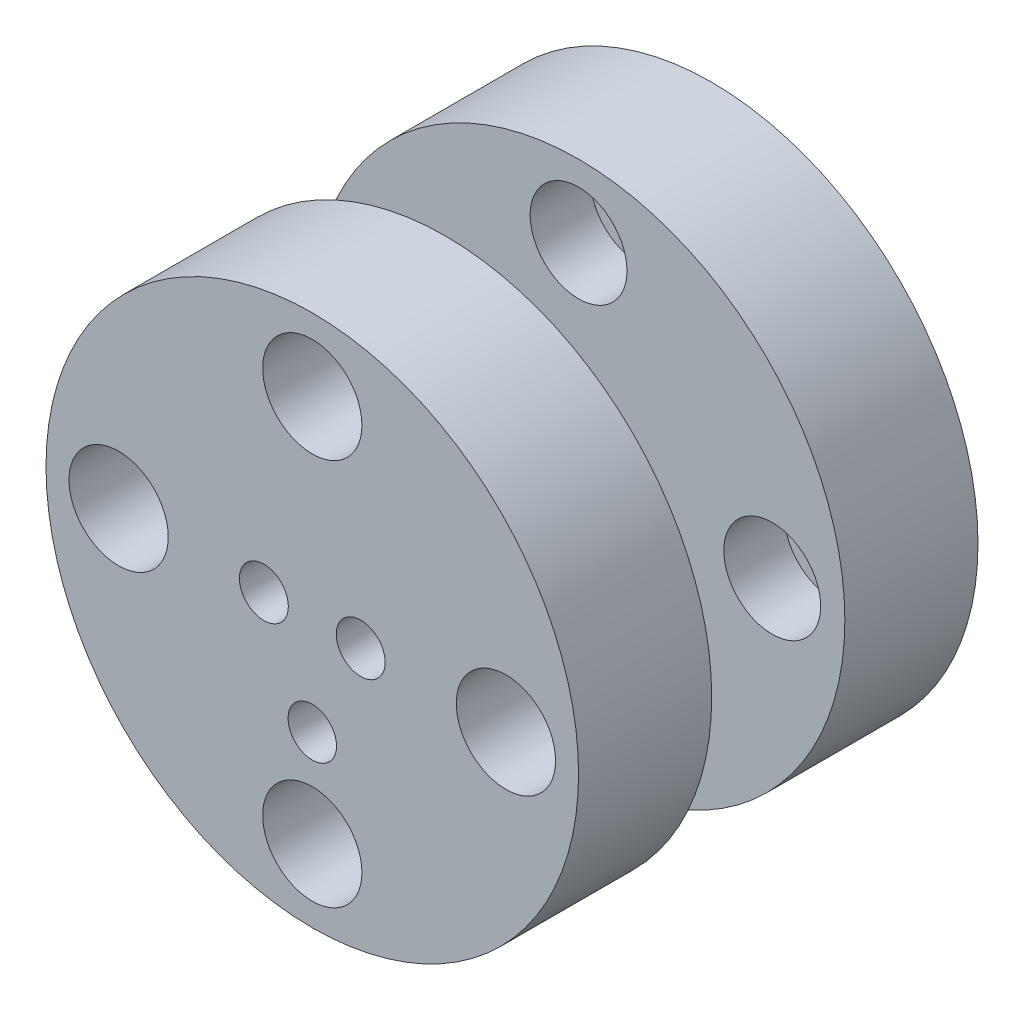
ISO-10303-21;
HEADER;
FILE_DESCRIPTION(('STEP AP214'),'2;1');
FILE_NAME('part.step','',(''),(''),'','','');
FILE_SCHEMA(('AUTOMOTIVE_DESIGN { 1 0 10303 214 1 1 1 1 }'));
ENDSEC;
DATA;
#1=APPLICATION_CONTEXT('core data for automotive mechanical design processes');
#2=APPLICATION_PROTOCOL_DEFINITION('international standard','automotive_design',2000,#1);
#3=PRODUCT_CONTEXT('',#1,'mechanical');
#4=PRODUCT('Part','Part','',(#3));
#5=PRODUCT_RELATED_PRODUCT_CATEGORY('part','',(#4));
#6=PRODUCT_DEFINITION_FORMATION('','',#4);
#7=PRODUCT_DEFINITION_CONTEXT('part definition',#1,'design');
#8=PRODUCT_DEFINITION('design','',#6,#7);
#9=PRODUCT_DEFINITION_SHAPE('','',#8);
#10=(LENGTH_UNIT() NAMED_UNIT(*) SI_UNIT(.MILLI.,.METRE.));
#11=(NAMED_UNIT(*) PLANE_ANGLE_UNIT() SI_UNIT($,.RADIAN.));
#12=(NAMED_UNIT(*) SI_UNIT($,.STERADIAN.) SOLID_ANGLE_UNIT());
#13=UNCERTAINTY_MEASURE_WITH_UNIT(LENGTH_MEASURE(1.E-05),#10,'distance_accuracy_value','');
#14=(GEOMETRIC_REPRESENTATION_CONTEXT(3) GLOBAL_UNCERTAINTY_ASSIGNED_CONTEXT((#13)) GLOBAL_UNIT_ASSIGNED_CONTEXT((#10,
#11,#12)) REPRESENTATION_CONTEXT('',''));
#15=CARTESIAN_POINT('',(0.,0.,0.));
#16=DIRECTION('',(0.,0.,1.));
#17=DIRECTION('',(1.,0.,0.));
#18=AXIS2_PLACEMENT_3D('',#15,#16,#17);
#19=CARTESIAN_POINT('',(0.,0.,16.5));
#20=DIRECTION('',(0.,0.,1.));
#21=DIRECTION('',(1.,0.,0.));
#22=AXIS2_PLACEMENT_3D('',#19,#20,#21);
#23=PLANE('',#22);
#24=CARTESIAN_POINT('',(0.,-4.,16.5));
#25=DIRECTION('',(0.,0.,1.));
#26=DIRECTION('',(1.,0.,0.));
#27=AXIS2_PLACEMENT_3D('',#24,#25,#26);
#28=CIRCLE('',#27,1.);
#29=CARTESIAN_POINT('',(1.,-4.,16.5));
#30=VERTEX_POINT('',#29);
#31=EDGE_CURVE('E127',#30,#30,#28,.T.);
#32=ORIENTED_EDGE('',*,*,#31,.F.);
#33=EDGE_LOOP('',(#32));
#34=FACE_BOUND('',#33,.T.);
#35=CARTESIAN_POINT('',(-2.,0.,16.5));
#36=DIRECTION('',(0.,0.,1.));
#37=DIRECTION('',(1.,0.,0.));
#38=AXIS2_PLACEMENT_3D('',#35,#36,#37);
#39=CIRCLE('',#38,1.01);
#40=CARTESIAN_POINT('',(-0.99,0.,16.5));
#41=VERTEX_POINT('',#40);
#42=EDGE_CURVE('E64',#41,#41,#39,.T.);
#43=ORIENTED_EDGE('',*,*,#42,.F.);
#44=EDGE_LOOP('',(#43));
#45=FACE_BOUND('',#44,.T.);
#46=CARTESIAN_POINT('',(2.,0.,16.5));
#47=DIRECTION('',(0.,0.,1.));
#48=DIRECTION('',(-1.,0.,0.));
#49=AXIS2_PLACEMENT_3D('',#46,#47,#48);
#50=CIRCLE('',#49,1.01);
#51=CARTESIAN_POINT('',(3.01,0.,16.5));
#52=VERTEX_POINT('',#51);
#53=EDGE_CURVE('E70',#52,#52,#50,.T.);
#54=ORIENTED_EDGE('',*,*,#53,.F.);
#55=EDGE_LOOP('',(#54));
#56=FACE_BOUND('',#55,.T.);
#57=CARTESIAN_POINT('',(8.,0.,16.5));
#58=DIRECTION('',(0.,0.,1.));
#59=DIRECTION('',(1.,0.,0.));
#60=AXIS2_PLACEMENT_3D('',#57,#58,#59);
#61=CIRCLE('',#60,2.05);
#62=CARTESIAN_POINT('',(10.05,0.,16.5));
#63=VERTEX_POINT('',#62);
#64=EDGE_CURVE('E86',#63,#63,#61,.T.);
#65=ORIENTED_EDGE('',*,*,#64,.F.);
#66=EDGE_LOOP('',(#65));
#67=FACE_BOUND('',#66,.T.);
#68=CARTESIAN_POINT('',(-8.,0.,16.5));
#69=DIRECTION('',(0.,0.,1.));
#70=DIRECTION('',(1.,0.,0.));
#71=AXIS2_PLACEMENT_3D('',#68,#69,#70);
#72=CIRCLE('',#71,2.05);
#73=CARTESIAN_POINT('',(-5.95,0.,16.5));
#74=VERTEX_POINT('',#73);
#75=EDGE_CURVE('E57',#74,#74,#72,.T.);
#76=ORIENTED_EDGE('',*,*,#75,.F.);
#77=EDGE_LOOP('',(#76));
#78=FACE_BOUND('',#77,.T.);
#79=CARTESIAN_POINT('',(0.,0.,16.5));
#80=DIRECTION('',(0.,0.,1.));
#81=DIRECTION('',(1.,0.,0.));
#82=AXIS2_PLACEMENT_3D('',#79,#80,#81);
#83=CIRCLE('',#82,11.);
#84=CARTESIAN_POINT('',(11.,0.,16.5));
#85=VERTEX_POINT('',#84);
#86=EDGE_CURVE('E11',#85,#85,#83,.T.);
#87=ORIENTED_EDGE('',*,*,#86,.T.);
#88=EDGE_LOOP('',(#87));
#89=FACE_BOUND('',#88,.T.);
#90=CARTESIAN_POINT('',(0.,8.,16.5));
#91=DIRECTION('',(0.,0.,1.));
#92=DIRECTION('',(1.,0.,0.));
#93=AXIS2_PLACEMENT_3D('',#90,#91,#92);
#94=CIRCLE('',#93,2.05);
#95=CARTESIAN_POINT('',(2.05,8.,16.5));
#96=VERTEX_POINT('',#95);
#97=EDGE_CURVE('E92',#96,#96,#94,.T.);
#98=ORIENTED_EDGE('',*,*,#97,.F.);
#99=EDGE_LOOP('',(#98));
#100=FACE_BOUND('',#99,.T.);
#101=CARTESIAN_POINT('',(0.,-8.,16.5));
#102=DIRECTION('',(0.,0.,1.));
#103=DIRECTION('',(1.,0.,0.));
#104=AXIS2_PLACEMENT_3D('',#101,#102,#103);
#105=CIRCLE('',#104,2.05);
#106=CARTESIAN_POINT('',(2.05,-8.,16.5));
#107=VERTEX_POINT('',#106);
#108=EDGE_CURVE('E80',#107,#107,#105,.T.);
#109=ORIENTED_EDGE('',*,*,#108,.F.);
#110=EDGE_LOOP('',(#109));
#111=FACE_BOUND('',#110,.T.);
#112=ADVANCED_FACE('F44',(#34,#45,#56,#67,#78,#89,#100,#111),#23,.T.);
#113=CARTESIAN_POINT('',(0.,0.,11.));
#114=DIRECTION('',(0.,0.,1.));
#115=DIRECTION('',(1.,0.,0.));
#116=AXIS2_PLACEMENT_3D('',#113,#114,#115);
#117=PLANE('',#116);
#118=CARTESIAN_POINT('',(0.,-4.,11.));
#119=DIRECTION('',(0.,0.,1.));
#120=DIRECTION('',(1.,0.,0.));
#121=AXIS2_PLACEMENT_3D('',#118,#119,#120);
#122=CIRCLE('',#121,1.);
#123=CARTESIAN_POINT('',(1.,-4.,11.));
#124=VERTEX_POINT('',#123);
#125=EDGE_CURVE('E75',#124,#124,#122,.F.);
#126=ORIENTED_EDGE('',*,*,#125,.F.);
#127=EDGE_LOOP('',(#126));
#128=FACE_BOUND('',#127,.T.);
#129=CARTESIAN_POINT('',(-2.,0.,11.));
#130=DIRECTION('',(0.,0.,1.));
#131=DIRECTION('',(1.,0.,0.));
#132=AXIS2_PLACEMENT_3D('',#129,#130,#131);
#133=CIRCLE('',#132,1.01);
#134=CARTESIAN_POINT('',(-0.99,0.,11.));
#135=VERTEX_POINT('',#134);
#136=EDGE_CURVE('E48',#135,#135,#133,.T.);
#137=ORIENTED_EDGE('',*,*,#136,.T.);
#138=EDGE_LOOP('',(#137));
#139=FACE_BOUND('',#138,.T.);
#140=CARTESIAN_POINT('',(2.,0.,11.));
#141=DIRECTION('',(0.,0.,1.));
#142=DIRECTION('',(1.,0.,0.));
#143=AXIS2_PLACEMENT_3D('',#140,#141,#142);
#144=CIRCLE('',#143,1.01);
#145=CARTESIAN_POINT('',(3.01,0.,11.));
#146=VERTEX_POINT('',#145);
#147=EDGE_CURVE('E62',#146,#146,#144,.T.);
#148=ORIENTED_EDGE('',*,*,#147,.T.);
#149=EDGE_LOOP('',(#148));
#150=FACE_BOUND('',#149,.T.);
#151=CARTESIAN_POINT('',(0.,0.,11.));
#152=DIRECTION('',(0.,0.,1.));
#153=DIRECTION('',(1.,0.,0.));
#154=AXIS2_PLACEMENT_3D('',#151,#152,#153);
#155=CIRCLE('',#154,11.);
#156=CARTESIAN_POINT('',(11.,0.,11.));
#157=VERTEX_POINT('',#156);
#158=EDGE_CURVE('E52',#157,#157,#155,.T.);
#159=ORIENTED_EDGE('',*,*,#158,.F.);
#160=EDGE_LOOP('',(#159));
#161=FACE_BOUND('',#160,.T.);
#162=CARTESIAN_POINT('',(-8.,0.,11.));
#163=DIRECTION('',(0.,0.,1.));
#164=DIRECTION('',(1.,0.,0.));
#165=AXIS2_PLACEMENT_3D('',#162,#163,#164);
#166=CIRCLE('',#165,2.05);
#167=CARTESIAN_POINT('',(-5.95,0.,11.));
#168=VERTEX_POINT('',#167);
#169=EDGE_CURVE('E60',#168,#168,#166,.T.);
#170=ORIENTED_EDGE('',*,*,#169,.T.);
#171=EDGE_LOOP('',(#170));
#172=FACE_BOUND('',#171,.T.);
#173=CARTESIAN_POINT('',(0.,8.,11.));
#174=DIRECTION('',(0.,0.,1.));
#175=DIRECTION('',(1.,0.,0.));
#176=AXIS2_PLACEMENT_3D('',#173,#174,#175);
#177=CIRCLE('',#176,2.05);
#178=CARTESIAN_POINT('',(2.05,8.,11.));
#179=VERTEX_POINT('',#178);
#180=EDGE_CURVE('E89',#179,#179,#177,.T.);
#181=ORIENTED_EDGE('',*,*,#180,.T.);
#182=EDGE_LOOP('',(#181));
#183=FACE_BOUND('',#182,.T.);
#184=CARTESIAN_POINT('',(8.,0.,11.));
#185=DIRECTION('',(0.,0.,1.));
#186=DIRECTION('',(1.,0.,0.));
#187=AXIS2_PLACEMENT_3D('',#184,#185,#186);
#188=CIRCLE('',#187,2.05);
#189=CARTESIAN_POINT('',(10.05,0.,11.));
#190=VERTEX_POINT('',#189);
#191=EDGE_CURVE('E83',#190,#190,#188,.T.);
#192=ORIENTED_EDGE('',*,*,#191,.T.);
#193=EDGE_LOOP('',(#192));
#194=FACE_BOUND('',#193,.T.);
#195=CARTESIAN_POINT('',(0.,-8.,11.));
#196=DIRECTION('',(0.,0.,1.));
#197=DIRECTION('',(1.,0.,0.));
#198=AXIS2_PLACEMENT_3D('',#195,#196,#197);
#199=CIRCLE('',#198,2.05);
#200=CARTESIAN_POINT('',(2.05,-8.,11.));
#201=VERTEX_POINT('',#200);
#202=EDGE_CURVE('E68',#201,#201,#199,.T.);
#203=ORIENTED_EDGE('',*,*,#202,.T.);
#204=EDGE_LOOP('',(#203));
#205=FACE_BOUND('',#204,.T.);
#206=ADVANCED_FACE('F102',(#128,#139,#150,#161,#172,#183,#194,#205),#117,.F.);
#207=CARTESIAN_POINT('',(0.,0.,16.5));
#208=DIRECTION('',(0.,0.,-1.));
#209=DIRECTION('',(-1.,0.,0.));
#210=AXIS2_PLACEMENT_3D('',#207,#208,#209);
#211=CYLINDRICAL_SURFACE('',#210,11.);
#212=ORIENTED_EDGE('',*,*,#86,.F.);
#213=EDGE_LOOP('',(#212));
#214=FACE_BOUND('',#213,.T.);
#215=ORIENTED_EDGE('',*,*,#158,.T.);
#216=EDGE_LOOP('',(#215));
#217=FACE_BOUND('',#216,.T.);
#218=ADVANCED_FACE('F46',(#214,#217),#211,.T.);
#219=CARTESIAN_POINT('',(-8.,0.,16.5));
#220=DIRECTION('',(0.,0.,-1.));
#221=DIRECTION('',(-1.,0.,0.));
#222=AXIS2_PLACEMENT_3D('',#219,#220,#221);
#223=CYLINDRICAL_SURFACE('',#222,2.05);
#224=ORIENTED_EDGE('',*,*,#75,.T.);
#225=EDGE_LOOP('',(#224));
#226=FACE_BOUND('',#225,.T.);
#227=ORIENTED_EDGE('',*,*,#169,.F.);
#228=EDGE_LOOP('',(#227));
#229=FACE_BOUND('',#228,.T.);
#230=ADVANCED_FACE('F105',(#226,#229),#223,.F.);
#231=CARTESIAN_POINT('',(0.,8.,16.5));
#232=DIRECTION('',(0.,0.,-1.));
#233=DIRECTION('',(-1.,0.,0.));
#234=AXIS2_PLACEMENT_3D('',#231,#232,#233);
#235=CYLINDRICAL_SURFACE('',#234,2.05);
#236=ORIENTED_EDGE('',*,*,#97,.T.);
#237=EDGE_LOOP('',(#236));
#238=FACE_BOUND('',#237,.T.);
#239=ORIENTED_EDGE('',*,*,#180,.F.);
#240=EDGE_LOOP('',(#239));
#241=FACE_BOUND('',#240,.T.);
#242=ADVANCED_FACE('F107',(#238,#241),#235,.F.);
#243=CARTESIAN_POINT('',(8.,0.,16.5));
#244=DIRECTION('',(0.,0.,-1.));
#245=DIRECTION('',(-1.,0.,0.));
#246=AXIS2_PLACEMENT_3D('',#243,#244,#245);
#247=CYLINDRICAL_SURFACE('',#246,2.05);
#248=ORIENTED_EDGE('',*,*,#64,.T.);
#249=EDGE_LOOP('',(#248));
#250=FACE_BOUND('',#249,.T.);
#251=ORIENTED_EDGE('',*,*,#191,.F.);
#252=EDGE_LOOP('',(#251));
#253=FACE_BOUND('',#252,.T.);
#254=ADVANCED_FACE('F113',(#250,#253),#247,.F.);
#255=CARTESIAN_POINT('',(0.,-8.,16.5));
#256=DIRECTION('',(0.,0.,-1.));
#257=DIRECTION('',(-1.,0.,0.));
#258=AXIS2_PLACEMENT_3D('',#255,#256,#257);
#259=CYLINDRICAL_SURFACE('',#258,2.05);
#260=ORIENTED_EDGE('',*,*,#108,.T.);
#261=EDGE_LOOP('',(#260));
#262=FACE_BOUND('',#261,.T.);
#263=ORIENTED_EDGE('',*,*,#202,.F.);
#264=EDGE_LOOP('',(#263));
#265=FACE_BOUND('',#264,.T.);
#266=ADVANCED_FACE('F138',(#262,#265),#259,.F.);
#267=CARTESIAN_POINT('',(2.,0.,2.64328860400635));
#268=DIRECTION('',(0.,0.,1.));
#269=DIRECTION('',(1.,0.,0.));
#270=AXIS2_PLACEMENT_3D('',#267,#268,#269);
#271=CYLINDRICAL_SURFACE('',#270,1.01);
#272=CARTESIAN_POINT('',(3.01,0.,16.5));
#273=CARTESIAN_POINT('',(3.01,0.,16.4427083333333));
#274=CARTESIAN_POINT('',(3.01,0.,16.3854166666667));
#275=CARTESIAN_POINT('',(3.01,0.,16.2708333333333));
#276=CARTESIAN_POINT('',(3.01,0.,16.2135416666667));
#277=CARTESIAN_POINT('',(3.01,0.,16.0989583333333));
#278=CARTESIAN_POINT('',(3.01,0.,16.0416666666667));
#279=CARTESIAN_POINT('',(3.01,0.,15.9270833333333));
#280=CARTESIAN_POINT('',(3.01,0.,15.8697916666667));
#281=CARTESIAN_POINT('',(3.01,0.,15.7552083333333));
#282=CARTESIAN_POINT('',(3.01,0.,15.6979166666667));
#283=CARTESIAN_POINT('',(3.01,0.,15.5833333333333));
#284=CARTESIAN_POINT('',(3.01,0.,15.5260416666667));
#285=CARTESIAN_POINT('',(3.01,0.,15.4114583333333));
#286=CARTESIAN_POINT('',(3.01,0.,15.3541666666667));
#287=CARTESIAN_POINT('',(3.01,0.,15.2395833333333));
#288=CARTESIAN_POINT('',(3.01,0.,15.1822916666667));
#289=CARTESIAN_POINT('',(3.01,0.,15.0677083333333));
#290=CARTESIAN_POINT('',(3.01,0.,15.0104166666667));
#291=CARTESIAN_POINT('',(3.01,0.,14.8958333333333));
#292=CARTESIAN_POINT('',(3.01,0.,14.8385416666667));
#293=CARTESIAN_POINT('',(3.01,0.,14.7239583333333));
#294=CARTESIAN_POINT('',(3.01,0.,14.6666666666667));
#295=CARTESIAN_POINT('',(3.01,0.,14.5520833333333));
#296=CARTESIAN_POINT('',(3.01,0.,14.4947916666667));
#297=CARTESIAN_POINT('',(3.01,0.,14.3802083333333));
#298=CARTESIAN_POINT('',(3.01,0.,14.3229166666667));
#299=CARTESIAN_POINT('',(3.01,0.,14.2083333333333));
#300=CARTESIAN_POINT('',(3.01,0.,14.1510416666667));
#301=CARTESIAN_POINT('',(3.01,0.,14.0364583333333));
#302=CARTESIAN_POINT('',(3.01,0.,13.9791666666667));
#303=CARTESIAN_POINT('',(3.01,0.,13.8645833333333));
#304=CARTESIAN_POINT('',(3.01,0.,13.8072916666667));
#305=CARTESIAN_POINT('',(3.01,0.,13.6927083333333));
#306=CARTESIAN_POINT('',(3.01,0.,13.6354166666667));
#307=CARTESIAN_POINT('',(3.01,0.,13.5208333333333));
#308=CARTESIAN_POINT('',(3.01,0.,13.4635416666667));
#309=CARTESIAN_POINT('',(3.01,0.,13.3489583333333));
#310=CARTESIAN_POINT('',(3.01,0.,13.2916666666667));
#311=CARTESIAN_POINT('',(3.01,0.,13.1770833333333));
#312=CARTESIAN_POINT('',(3.01,0.,13.1197916666667));
#313=CARTESIAN_POINT('',(3.01,0.,13.0052083333333));
#314=CARTESIAN_POINT('',(3.01,0.,12.9479166666667));
#315=CARTESIAN_POINT('',(3.01,0.,12.8333333333333));
#316=CARTESIAN_POINT('',(3.01,0.,12.7760416666667));
#317=CARTESIAN_POINT('',(3.01,0.,12.6614583333333));
#318=CARTESIAN_POINT('',(3.01,0.,12.6041666666667));
#319=CARTESIAN_POINT('',(3.01,0.,12.4895833333333));
#320=CARTESIAN_POINT('',(3.01,0.,12.4322916666667));
#321=CARTESIAN_POINT('',(3.01,0.,12.3177083333333));
#322=CARTESIAN_POINT('',(3.01,0.,12.2604166666667));
#323=CARTESIAN_POINT('',(3.01,0.,12.1458333333333));
#324=CARTESIAN_POINT('',(3.01,0.,12.0885416666667));
#325=CARTESIAN_POINT('',(3.01,0.,11.9739583333333));
#326=CARTESIAN_POINT('',(3.01,0.,11.9166666666667));
#327=CARTESIAN_POINT('',(3.01,0.,11.8020833333333));
#328=CARTESIAN_POINT('',(3.01,0.,11.7447916666667));
#329=CARTESIAN_POINT('',(3.01,0.,11.6302083333333));
#330=CARTESIAN_POINT('',(3.01,0.,11.5729166666667));
#331=CARTESIAN_POINT('',(3.01,0.,11.4583333333333));
#332=CARTESIAN_POINT('',(3.01,0.,11.4010416666667));
#333=CARTESIAN_POINT('',(3.01,0.,11.2864583333333));
#334=CARTESIAN_POINT('',(3.01,0.,11.2291666666667));
#335=CARTESIAN_POINT('',(3.01,0.,11.1145833333333));
#336=CARTESIAN_POINT('',(3.01,0.,11.0572916666667));
#337=CARTESIAN_POINT('',(3.01,0.,11.));
#338=B_SPLINE_CURVE_WITH_KNOTS('',3,(#272,#273,#274,#275,#276,#277,#278,#279,#280,#281,#282,
#283,#284,#285,#286,#287,#288,#289,#290,#291,#292,#293,#294,#295,#296,#297,#298,#299,#300,#301,
#302,#303,#304,#305,#306,#307,#308,#309,#310,#311,#312,#313,#314,#315,#316,#317,#318,#319,#320,
#321,#322,#323,#324,#325,#326,#327,#328,#329,#330,#331,#332,#333,#334,#335,#336,#337),
.UNSPECIFIED.,.F.,.F.,(4,2,2,2,2,2,2,2,2,2,2,2,2,2,2,2,2,2,2,2,2,2,2,2,2,2,2,2,2,2,2,2,4),(0.,
0.171874999999998,0.34375,0.515625000000002,0.687500000000001,0.859374999999999,1.03125,
1.203125,1.375,1.546875,1.71875,1.890625,2.0625,2.234375,2.40625,2.578125,2.75,2.921875,3.09375,
3.265625,3.4375,3.609375,3.78125,3.953125,4.125,4.296875,4.46875,4.640625,4.8125,4.984375,
5.15625,5.328125,5.5),.UNSPECIFIED.);
#339=EDGE_CURVE('BSEAM141',#52,#146,#338,.T.);
#340=ORIENTED_EDGE('',*,*,#53,.T.);
#341=ORIENTED_EDGE('',*,*,#147,.F.);
#342=ORIENTED_EDGE('',*,*,#339,.T.);
#343=ORIENTED_EDGE('',*,*,#339,.F.);
#344=EDGE_LOOP('',(#340,#342,#341,#343));
#345=FACE_BOUND('',#344,.T.);
#346=ADVANCED_FACE('F141',(#345),#271,.F.);
#347=CARTESIAN_POINT('',(-2.,0.,2.64328860400635));
#348=DIRECTION('',(0.,0.,1.));
#349=DIRECTION('',(1.,0.,0.));
#350=AXIS2_PLACEMENT_3D('',#347,#348,#349);
#351=CYLINDRICAL_SURFACE('',#350,1.01);
#352=CARTESIAN_POINT('',(-0.99,0.,16.5));
#353=CARTESIAN_POINT('',(-0.99,0.,16.4427083333333));
#354=CARTESIAN_POINT('',(-0.99,0.,16.3854166666667));
#355=CARTESIAN_POINT('',(-0.99,0.,16.2708333333333));
#356=CARTESIAN_POINT('',(-0.99,0.,16.2135416666667));
#357=CARTESIAN_POINT('',(-0.99,0.,16.0989583333333));
#358=CARTESIAN_POINT('',(-0.99,0.,16.0416666666667));
#359=CARTESIAN_POINT('',(-0.99,0.,15.9270833333333));
#360=CARTESIAN_POINT('',(-0.99,0.,15.8697916666667));
#361=CARTESIAN_POINT('',(-0.99,0.,15.7552083333333));
#362=CARTESIAN_POINT('',(-0.99,0.,15.6979166666667));
#363=CARTESIAN_POINT('',(-0.99,0.,15.5833333333333));
#364=CARTESIAN_POINT('',(-0.99,0.,15.5260416666667));
#365=CARTESIAN_POINT('',(-0.99,0.,15.4114583333333));
#366=CARTESIAN_POINT('',(-0.99,0.,15.3541666666667));
#367=CARTESIAN_POINT('',(-0.99,0.,15.2395833333333));
#368=CARTESIAN_POINT('',(-0.99,0.,15.1822916666667));
#369=CARTESIAN_POINT('',(-0.99,0.,15.0677083333333));
#370=CARTESIAN_POINT('',(-0.99,0.,15.0104166666667));
#371=CARTESIAN_POINT('',(-0.99,0.,14.8958333333333));
#372=CARTESIAN_POINT('',(-0.99,0.,14.8385416666667));
#373=CARTESIAN_POINT('',(-0.99,0.,14.7239583333333));
#374=CARTESIAN_POINT('',(-0.99,0.,14.6666666666667));
#375=CARTESIAN_POINT('',(-0.99,0.,14.5520833333333));
#376=CARTESIAN_POINT('',(-0.99,0.,14.4947916666667));
#377=CARTESIAN_POINT('',(-0.99,0.,14.3802083333333));
#378=CARTESIAN_POINT('',(-0.99,0.,14.3229166666667));
#379=CARTESIAN_POINT('',(-0.99,0.,14.2083333333333));
#380=CARTESIAN_POINT('',(-0.99,0.,14.1510416666667));
#381=CARTESIAN_POINT('',(-0.99,0.,14.0364583333333));
#382=CARTESIAN_POINT('',(-0.99,0.,13.9791666666667));
#383=CARTESIAN_POINT('',(-0.99,0.,13.8645833333333));
#384=CARTESIAN_POINT('',(-0.99,0.,13.8072916666667));
#385=CARTESIAN_POINT('',(-0.99,0.,13.6927083333333));
#386=CARTESIAN_POINT('',(-0.99,0.,13.6354166666667));
#387=CARTESIAN_POINT('',(-0.99,0.,13.5208333333333));
#388=CARTESIAN_POINT('',(-0.99,0.,13.4635416666667));
#389=CARTESIAN_POINT('',(-0.99,0.,13.3489583333333));
#390=CARTESIAN_POINT('',(-0.99,0.,13.2916666666667));
#391=CARTESIAN_POINT('',(-0.99,0.,13.1770833333333));
#392=CARTESIAN_POINT('',(-0.99,0.,13.1197916666667));
#393=CARTESIAN_POINT('',(-0.99,0.,13.0052083333333));
#394=CARTESIAN_POINT('',(-0.99,0.,12.9479166666667));
#395=CARTESIAN_POINT('',(-0.99,0.,12.8333333333333));
#396=CARTESIAN_POINT('',(-0.99,0.,12.7760416666667));
#397=CARTESIAN_POINT('',(-0.99,0.,12.6614583333333));
#398=CARTESIAN_POINT('',(-0.99,0.,12.6041666666667));
#399=CARTESIAN_POINT('',(-0.99,0.,12.4895833333333));
#400=CARTESIAN_POINT('',(-0.99,0.,12.4322916666667));
#401=CARTESIAN_POINT('',(-0.99,0.,12.3177083333333));
#402=CARTESIAN_POINT('',(-0.99,0.,12.2604166666667));
#403=CARTESIAN_POINT('',(-0.99,0.,12.1458333333333));
#404=CARTESIAN_POINT('',(-0.99,0.,12.0885416666667));
#405=CARTESIAN_POINT('',(-0.99,0.,11.9739583333333));
#406=CARTESIAN_POINT('',(-0.99,0.,11.9166666666667));
#407=CARTESIAN_POINT('',(-0.99,0.,11.8020833333333));
#408=CARTESIAN_POINT('',(-0.99,0.,11.7447916666667));
#409=CARTESIAN_POINT('',(-0.99,0.,11.6302083333333));
#410=CARTESIAN_POINT('',(-0.99,0.,11.5729166666667));
#411=CARTESIAN_POINT('',(-0.99,0.,11.4583333333333));
#412=CARTESIAN_POINT('',(-0.99,0.,11.4010416666667));
#413=CARTESIAN_POINT('',(-0.99,0.,11.2864583333333));
#414=CARTESIAN_POINT('',(-0.99,0.,11.2291666666667));
#415=CARTESIAN_POINT('',(-0.99,0.,11.1145833333333));
#416=CARTESIAN_POINT('',(-0.99,0.,11.0572916666667));
#417=CARTESIAN_POINT('',(-0.99,0.,11.));
#418=B_SPLINE_CURVE_WITH_KNOTS('',3,(#352,#353,#354,#355,#356,#357,#358,#359,#360,#361,#362,
#363,#364,#365,#366,#367,#368,#369,#370,#371,#372,#373,#374,#375,#376,#377,#378,#379,#380,#381,
#382,#383,#384,#385,#386,#387,#388,#389,#390,#391,#392,#393,#394,#395,#396,#397,#398,#399,#400,
#401,#402,#403,#404,#405,#406,#407,#408,#409,#410,#411,#412,#413,#414,#415,#416,#417),
.UNSPECIFIED.,.F.,.F.,(4,2,2,2,2,2,2,2,2,2,2,2,2,2,2,2,2,2,2,2,2,2,2,2,2,2,2,2,2,2,2,2,4),(0.,
0.171874999999998,0.34375,0.515625000000002,0.687500000000001,0.859374999999999,1.03125,
1.203125,1.375,1.546875,1.71875,1.890625,2.0625,2.234375,2.40625,2.578125,2.75,2.921875,3.09375,
3.265625,3.4375,3.609375,3.78125,3.953125,4.125,4.296875,4.46875,4.640625,4.8125,4.984375,
5.15625,5.328125,5.5),.UNSPECIFIED.);
#419=EDGE_CURVE('BSEAM149',#41,#135,#418,.T.);
#420=ORIENTED_EDGE('',*,*,#42,.T.);
#421=ORIENTED_EDGE('',*,*,#136,.F.);
#422=ORIENTED_EDGE('',*,*,#419,.T.);
#423=ORIENTED_EDGE('',*,*,#419,.F.);
#424=EDGE_LOOP('',(#420,#422,#421,#423));
#425=FACE_BOUND('',#424,.T.);
#426=ADVANCED_FACE('F149',(#425),#351,.F.);
#427=CARTESIAN_POINT('',(0.,-4.,8.17157287525381));
#428=DIRECTION('',(0.,0.,1.));
#429=DIRECTION('',(1.,0.,0.));
#430=AXIS2_PLACEMENT_3D('',#427,#428,#429);
#431=CYLINDRICAL_SURFACE('',#430,1.);
#432=ORIENTED_EDGE('',*,*,#125,.T.);
#433=EDGE_LOOP('',(#432));
#434=FACE_BOUND('',#433,.T.);
#435=ORIENTED_EDGE('',*,*,#31,.T.);
#436=EDGE_LOOP('',(#435));
#437=FACE_BOUND('',#436,.T.);
#438=ADVANCED_FACE('F157',(#434,#437),#431,.F.);
#439=CLOSED_SHELL('',(#112,#206,#218,#230,#242,#254,#266,#346,#426,#438));
#440=MANIFOLD_SOLID_BREP('B2',#439);
#441=CARTESIAN_POINT('',(0.,0.,11.));
#442=DIRECTION('',(0.,0.,-1.));
#443=DIRECTION('',(-1.,0.,0.));
#444=AXIS2_PLACEMENT_3D('',#441,#442,#443);
#445=CYLINDRICAL_SURFACE('',#444,3.);
#446=CARTESIAN_POINT('',(0.,0.,5.5));
#447=DIRECTION('',(0.,0.,1.));
#448=DIRECTION('',(1.,0.,0.));
#449=AXIS2_PLACEMENT_3D('',#446,#447,#448);
#450=CIRCLE('',#449,3.);
#451=CARTESIAN_POINT('',(2.994975,0.173564827586121,5.5));
#452=VERTEX_POINT('',#451);
#453=CARTESIAN_POINT('',(-2.994975,0.173564827586118,5.5));
#454=VERTEX_POINT('',#453);
#455=EDGE_CURVE('E290',#452,#454,#450,.T.);
#456=ORIENTED_EDGE('',*,*,#455,.T.);
#457=DIRECTION('',(0.,0.,1.));
#458=VECTOR('',#457,1.);
#459=CARTESIAN_POINT('',(-2.994975,0.173564827586118,11.));
#460=LINE('',#459,#458);
#461=CARTESIAN_POINT('',(-2.994975,0.173564827586118,11.));
#462=VERTEX_POINT('',#461);
#463=EDGE_CURVE('E262',#454,#462,#460,.T.);
#464=ORIENTED_EDGE('',*,*,#463,.T.);
#465=CARTESIAN_POINT('',(0.,0.,11.));
#466=DIRECTION('',(0.,0.,1.));
#467=DIRECTION('',(1.,0.,0.));
#468=AXIS2_PLACEMENT_3D('',#465,#466,#467);
#469=CIRCLE('',#468,3.);
#470=CARTESIAN_POINT('',(2.994975,0.173564827586121,11.));
#471=VERTEX_POINT('',#470);
#472=EDGE_CURVE('E247',#471,#462,#469,.T.);
#473=ORIENTED_EDGE('',*,*,#472,.F.);
#474=DIRECTION('',(0.,0.,1.));
#475=VECTOR('',#474,1.);
#476=CARTESIAN_POINT('',(2.994975,0.173564827586121,11.));
#477=LINE('',#476,#475);
#478=EDGE_CURVE('E279',#471,#452,#477,.F.);
#479=ORIENTED_EDGE('',*,*,#478,.T.);
#480=EDGE_LOOP('',(#456,#464,#473,#479));
#481=FACE_BOUND('',#480,.T.);
#482=ADVANCED_FACE('F239',(#481),#445,.T.);
#483=CARTESIAN_POINT('',(-2.994975,-0.173564827586119,11.));
#484=VERTEX_POINT('',#483);
#485=CARTESIAN_POINT('',(2.994975,-0.173564827586116,11.));
#486=VERTEX_POINT('',#485);
#487=EDGE_CURVE('E294',#484,#486,#469,.T.);
#488=ORIENTED_EDGE('',*,*,#487,.F.);
#489=DIRECTION('',(0.,0.,1.));
#490=VECTOR('',#489,1.);
#491=CARTESIAN_POINT('',(-2.994975,-0.173564827586119,11.));
#492=LINE('',#491,#490);
#493=CARTESIAN_POINT('',(-2.994975,-0.173564827586119,5.5));
#494=VERTEX_POINT('',#493);
#495=EDGE_CURVE('E300',#484,#494,#492,.F.);
#496=ORIENTED_EDGE('',*,*,#495,.T.);
#497=CARTESIAN_POINT('',(2.994975,-0.173564827586116,5.5));
#498=VERTEX_POINT('',#497);
#499=EDGE_CURVE('E295',#494,#498,#450,.T.);
#500=ORIENTED_EDGE('',*,*,#499,.T.);
#501=DIRECTION('',(0.,0.,1.));
#502=VECTOR('',#501,1.);
#503=CARTESIAN_POINT('',(2.994975,-0.173564827586116,11.));
#504=LINE('',#503,#502);
#505=EDGE_CURVE('E254',#498,#486,#504,.T.);
#506=ORIENTED_EDGE('',*,*,#505,.T.);
#507=EDGE_LOOP('',(#488,#496,#500,#506));
#508=FACE_BOUND('',#507,.T.);
#509=ADVANCED_FACE('F241',(#508),#445,.T.);
#510=CARTESIAN_POINT('',(0.,0.,11.));
#511=DIRECTION('',(0.,0.,1.));
#512=DIRECTION('',(1.,0.,0.));
#513=AXIS2_PLACEMENT_3D('',#510,#511,#512);
#514=PLANE('',#513);
#515=CARTESIAN_POINT('',(-2.,0.,11.));
#516=DIRECTION('',(0.,0.,1.));
#517=DIRECTION('',(1.,0.,0.));
#518=AXIS2_PLACEMENT_3D('',#515,#516,#517);
#519=CIRCLE('',#518,1.01);
#520=EDGE_CURVE('E303',#484,#462,#519,.T.);
#521=ORIENTED_EDGE('',*,*,#520,.F.);
#522=ORIENTED_EDGE('',*,*,#487,.T.);
#523=CARTESIAN_POINT('',(2.,0.,11.));
#524=DIRECTION('',(0.,0.,1.));
#525=DIRECTION('',(1.,0.,0.));
#526=AXIS2_PLACEMENT_3D('',#523,#524,#525);
#527=CIRCLE('',#526,1.01);
#528=EDGE_CURVE('E285',#471,#486,#527,.T.);
#529=ORIENTED_EDGE('',*,*,#528,.F.);
#530=ORIENTED_EDGE('',*,*,#472,.T.);
#531=EDGE_LOOP('',(#521,#522,#529,#530));
#532=FACE_BOUND('',#531,.T.);
#533=ADVANCED_FACE('F310',(#532),#514,.T.);
#534=CARTESIAN_POINT('',(0.,0.,5.5));
#535=DIRECTION('',(0.,0.,1.));
#536=DIRECTION('',(1.,0.,0.));
#537=AXIS2_PLACEMENT_3D('',#534,#535,#536);
#538=PLANE('',#537);
#539=ORIENTED_EDGE('',*,*,#499,.F.);
#540=CARTESIAN_POINT('',(-2.,0.,5.5));
#541=DIRECTION('',(0.,0.,1.));
#542=DIRECTION('',(1.,0.,0.));
#543=AXIS2_PLACEMENT_3D('',#540,#541,#542);
#544=CIRCLE('',#543,1.01);
#545=EDGE_CURVE('E42',#494,#454,#544,.T.);
#546=ORIENTED_EDGE('',*,*,#545,.T.);
#547=ORIENTED_EDGE('',*,*,#455,.F.);
#548=CARTESIAN_POINT('',(2.,0.,5.5));
#549=DIRECTION('',(0.,0.,1.));
#550=DIRECTION('',(1.,0.,0.));
#551=AXIS2_PLACEMENT_3D('',#548,#549,#550);
#552=CIRCLE('',#551,1.01);
#553=EDGE_CURVE('E276',#498,#452,#552,.F.);
#554=ORIENTED_EDGE('',*,*,#553,.F.);
#555=EDGE_LOOP('',(#539,#546,#547,#554));
#556=FACE_BOUND('',#555,.T.);
#557=ADVANCED_FACE('F293',(#556),#538,.F.);
#558=CARTESIAN_POINT('',(2.,0.,2.64328860400635));
#559=DIRECTION('',(0.,0.,1.));
#560=DIRECTION('',(1.,0.,0.));
#561=AXIS2_PLACEMENT_3D('',#558,#559,#560);
#562=CYLINDRICAL_SURFACE('',#561,1.01);
#563=ORIENTED_EDGE('',*,*,#553,.T.);
#564=ORIENTED_EDGE('',*,*,#478,.F.);
#565=ORIENTED_EDGE('',*,*,#528,.T.);
#566=ORIENTED_EDGE('',*,*,#505,.F.);
#567=EDGE_LOOP('',(#563,#564,#565,#566));
#568=FACE_BOUND('',#567,.T.);
#569=ADVANCED_FACE('F278',(#568),#562,.F.);
#570=CARTESIAN_POINT('',(-2.,0.,2.64328860400635));
#571=DIRECTION('',(0.,0.,1.));
#572=DIRECTION('',(1.,0.,0.));
#573=AXIS2_PLACEMENT_3D('',#570,#571,#572);
#574=CYLINDRICAL_SURFACE('',#573,1.01);
#575=ORIENTED_EDGE('',*,*,#545,.F.);
#576=ORIENTED_EDGE('',*,*,#495,.F.);
#577=ORIENTED_EDGE('',*,*,#520,.T.);
#578=ORIENTED_EDGE('',*,*,#463,.F.);
#579=EDGE_LOOP('',(#575,#576,#577,#578));
#580=FACE_BOUND('',#579,.T.);
#581=ADVANCED_FACE('F311',(#580),#574,.F.);
#582=CLOSED_SHELL('',(#482,#509,#533,#557,#569,#581));
#583=MANIFOLD_SOLID_BREP('B6',#582);
#584=CARTESIAN_POINT('',(-8.,0.,5.5));
#585=DIRECTION('',(0.,0.,-1.));
#586=DIRECTION('',(-1.,0.,0.));
#587=AXIS2_PLACEMENT_3D('',#584,#585,#586);
#588=CYLINDRICAL_SURFACE('',#587,1.15);
#589=CARTESIAN_POINT('',(-8.,0.,0.));
#590=DIRECTION('',(0.,0.,1.));
#591=DIRECTION('',(1.,0.,0.));
#592=AXIS2_PLACEMENT_3D('',#589,#590,#591);
#593=CIRCLE('',#592,1.15);
#594=CARTESIAN_POINT('',(-6.85,0.,0.));
#595=VERTEX_POINT('',#594);
#596=EDGE_CURVE('E373',#595,#595,#593,.T.);
#597=ORIENTED_EDGE('',*,*,#596,.F.);
#598=EDGE_LOOP('',(#597));
#599=FACE_BOUND('',#598,.T.);
#600=CARTESIAN_POINT('',(-8.,0.,3.));
#601=DIRECTION('',(0.,0.,1.));
#602=DIRECTION('',(1.,0.,0.));
#603=AXIS2_PLACEMENT_3D('',#600,#601,#602);
#604=CIRCLE('',#603,1.15);
#605=CARTESIAN_POINT('',(-6.85,0.,3.));
#606=VERTEX_POINT('',#605);
#607=EDGE_CURVE('E364',#606,#606,#604,.T.);
#608=ORIENTED_EDGE('',*,*,#607,.T.);
#609=EDGE_LOOP('',(#608));
#610=FACE_BOUND('',#609,.T.);
#611=ADVANCED_FACE('F360',(#599,#610),#588,.F.);
#612=CARTESIAN_POINT('',(0.,8.,5.5));
#613=DIRECTION('',(0.,0.,-1.));
#614=DIRECTION('',(-1.,0.,0.));
#615=AXIS2_PLACEMENT_3D('',#612,#613,#614);
#616=CYLINDRICAL_SURFACE('',#615,1.15);
#617=CARTESIAN_POINT('',(0.,8.,0.));
#618=DIRECTION('',(0.,0.,1.));
#619=DIRECTION('',(1.,0.,0.));
#620=AXIS2_PLACEMENT_3D('',#617,#618,#619);
#621=CIRCLE('',#620,1.15);
#622=CARTESIAN_POINT('',(1.15,8.,0.));
#623=VERTEX_POINT('',#622);
#624=EDGE_CURVE('E409',#623,#623,#621,.T.);
#625=ORIENTED_EDGE('',*,*,#624,.F.);
#626=EDGE_LOOP('',(#625));
#627=FACE_BOUND('',#626,.T.);
#628=CARTESIAN_POINT('',(0.,8.,3.));
#629=DIRECTION('',(0.,0.,1.));
#630=DIRECTION('',(1.,0.,0.));
#631=AXIS2_PLACEMENT_3D('',#628,#629,#630);
#632=CIRCLE('',#631,1.15);
#633=CARTESIAN_POINT('',(1.15,8.,3.));
#634=VERTEX_POINT('',#633);
#635=EDGE_CURVE('E384',#634,#634,#632,.T.);
#636=ORIENTED_EDGE('',*,*,#635,.T.);
#637=EDGE_LOOP('',(#636));
#638=FACE_BOUND('',#637,.T.);
#639=ADVANCED_FACE('F419',(#627,#638),#616,.F.);
#640=CARTESIAN_POINT('',(8.,0.,5.5));
#641=DIRECTION('',(0.,0.,-1.));
#642=DIRECTION('',(-1.,0.,0.));
#643=AXIS2_PLACEMENT_3D('',#640,#641,#642);
#644=CYLINDRICAL_SURFACE('',#643,1.15);
#645=CARTESIAN_POINT('',(8.,0.,0.));
#646=DIRECTION('',(0.,0.,1.));
#647=DIRECTION('',(1.,0.,0.));
#648=AXIS2_PLACEMENT_3D('',#645,#646,#647);
#649=CIRCLE('',#648,1.15);
#650=CARTESIAN_POINT('',(9.15,0.,0.));
#651=VERTEX_POINT('',#650);
#652=EDGE_CURVE('E407',#651,#651,#649,.T.);
#653=ORIENTED_EDGE('',*,*,#652,.F.);
#654=EDGE_LOOP('',(#653));
#655=FACE_BOUND('',#654,.T.);
#656=CARTESIAN_POINT('',(8.,0.,3.));
#657=DIRECTION('',(0.,0.,1.));
#658=DIRECTION('',(1.,0.,0.));
#659=AXIS2_PLACEMENT_3D('',#656,#657,#658);
#660=CIRCLE('',#659,1.15);
#661=CARTESIAN_POINT('',(9.15,0.,3.));
#662=VERTEX_POINT('',#661);
#663=EDGE_CURVE('E381',#662,#662,#660,.T.);
#664=ORIENTED_EDGE('',*,*,#663,.T.);
#665=EDGE_LOOP('',(#664));
#666=FACE_BOUND('',#665,.T.);
#667=ADVANCED_FACE('F424',(#655,#666),#644,.F.);
#668=CARTESIAN_POINT('',(0.,-8.,5.5));
#669=DIRECTION('',(0.,0.,-1.));
#670=DIRECTION('',(-1.,0.,0.));
#671=AXIS2_PLACEMENT_3D('',#668,#669,#670);
#672=CYLINDRICAL_SURFACE('',#671,1.15);
#673=CARTESIAN_POINT('',(0.,-8.,0.));
#674=DIRECTION('',(0.,0.,1.));
#675=DIRECTION('',(1.,0.,0.));
#676=AXIS2_PLACEMENT_3D('',#673,#674,#675);
#677=CIRCLE('',#676,1.15);
#678=CARTESIAN_POINT('',(1.15,-8.,0.));
#679=VERTEX_POINT('',#678);
#680=EDGE_CURVE('E404',#679,#679,#677,.T.);
#681=ORIENTED_EDGE('',*,*,#680,.F.);
#682=EDGE_LOOP('',(#681));
#683=FACE_BOUND('',#682,.T.);
#684=CARTESIAN_POINT('',(0.,-8.,3.));
#685=DIRECTION('',(0.,0.,1.));
#686=DIRECTION('',(1.,0.,0.));
#687=AXIS2_PLACEMENT_3D('',#684,#685,#686);
#688=CIRCLE('',#687,1.15);
#689=CARTESIAN_POINT('',(1.15,-8.,3.));
#690=VERTEX_POINT('',#689);
#691=EDGE_CURVE('E378',#690,#690,#688,.T.);
#692=ORIENTED_EDGE('',*,*,#691,.T.);
#693=EDGE_LOOP('',(#692));
#694=FACE_BOUND('',#693,.T.);
#695=ADVANCED_FACE('F431',(#683,#694),#672,.F.);
#696=CARTESIAN_POINT('',(0.,0.,5.5));
#697=DIRECTION('',(0.,0.,1.));
#698=DIRECTION('',(1.,0.,0.));
#699=AXIS2_PLACEMENT_3D('',#696,#697,#698);
#700=PLANE('',#699);
#701=CARTESIAN_POINT('',(-8.,0.,5.5));
#702=DIRECTION('',(0.,0.,1.));
#703=DIRECTION('',(1.,0.,0.));
#704=AXIS2_PLACEMENT_3D('',#701,#702,#703);
#705=CIRCLE('',#704,2.);
#706=CARTESIAN_POINT('',(-6.,0.,5.5));
#707=VERTEX_POINT('',#706);
#708=EDGE_CURVE('E533',#707,#707,#705,.T.);
#709=ORIENTED_EDGE('',*,*,#708,.F.);
#710=EDGE_LOOP('',(#709));
#711=FACE_BOUND('',#710,.T.);
#712=CARTESIAN_POINT('',(0.,8.,5.5));
#713=DIRECTION('',(0.,0.,1.));
#714=DIRECTION('',(1.,0.,0.));
#715=AXIS2_PLACEMENT_3D('',#712,#713,#714);
#716=CIRCLE('',#715,2.);
#717=CARTESIAN_POINT('',(2.00000000000003,8.,5.5));
#718=VERTEX_POINT('',#717);
#719=EDGE_CURVE('E479',#718,#718,#716,.T.);
#720=ORIENTED_EDGE('',*,*,#719,.F.);
#721=EDGE_LOOP('',(#720));
#722=FACE_BOUND('',#721,.T.);
#723=CARTESIAN_POINT('',(8.,0.,5.5));
#724=DIRECTION('',(0.,0.,1.));
#725=DIRECTION('',(1.,0.,0.));
#726=AXIS2_PLACEMENT_3D('',#723,#724,#725);
#727=CIRCLE('',#726,2.);
#728=CARTESIAN_POINT('',(10.,0.,5.5));
#729=VERTEX_POINT('',#728);
#730=EDGE_CURVE('E480',#729,#729,#727,.T.);
#731=ORIENTED_EDGE('',*,*,#730,.F.);
#732=EDGE_LOOP('',(#731));
#733=FACE_BOUND('',#732,.T.);
#734=CARTESIAN_POINT('',(0.,-8.,5.5));
#735=DIRECTION('',(0.,0.,1.));
#736=DIRECTION('',(1.,0.,0.));
#737=AXIS2_PLACEMENT_3D('',#734,#735,#736);
#738=CIRCLE('',#737,2.);
#739=CARTESIAN_POINT('',(1.99999999999992,-8.,5.5));
#740=VERTEX_POINT('',#739);
#741=EDGE_CURVE('E492',#740,#740,#738,.T.);
#742=ORIENTED_EDGE('',*,*,#741,.F.);
#743=EDGE_LOOP('',(#742));
#744=FACE_BOUND('',#743,.T.);
#745=CARTESIAN_POINT('',(-2.,0.,5.5));
#746=DIRECTION('',(0.,0.,1.));
#747=DIRECTION('',(1.,0.,0.));
#748=AXIS2_PLACEMENT_3D('',#745,#746,#747);
#749=CIRCLE('',#748,0.8);
#750=CARTESIAN_POINT('',(-1.2,0.,5.5));
#751=VERTEX_POINT('',#750);
#752=EDGE_CURVE('E398',#751,#751,#749,.T.);
#753=ORIENTED_EDGE('',*,*,#752,.F.);
#754=EDGE_LOOP('',(#753));
#755=FACE_BOUND('',#754,.T.);
#756=CARTESIAN_POINT('',(2.,0.,5.5));
#757=DIRECTION('',(0.,0.,1.));
#758=DIRECTION('',(1.,0.,0.));
#759=AXIS2_PLACEMENT_3D('',#756,#757,#758);
#760=CIRCLE('',#759,0.8);
#761=CARTESIAN_POINT('',(2.8,0.,5.5));
#762=VERTEX_POINT('',#761);
#763=EDGE_CURVE('E389',#762,#762,#760,.T.);
#764=ORIENTED_EDGE('',*,*,#763,.F.);
#765=EDGE_LOOP('',(#764));
#766=FACE_BOUND('',#765,.T.);
#767=CARTESIAN_POINT('',(0.,0.,5.5));
#768=DIRECTION('',(0.,0.,1.));
#769=DIRECTION('',(1.,0.,0.));
#770=AXIS2_PLACEMENT_3D('',#767,#768,#769);
#771=CIRCLE('',#770,11.);
#772=CARTESIAN_POINT('',(11.,0.,5.5));
#773=VERTEX_POINT('',#772);
#774=EDGE_CURVE('E238',#773,#773,#771,.T.);
#775=ORIENTED_EDGE('',*,*,#774,.T.);
#776=EDGE_LOOP('',(#775));
#777=FACE_BOUND('',#776,.T.);
#778=ADVANCED_FACE('F429',(#711,#722,#733,#744,#755,#766,#777),#700,.T.);
#779=CARTESIAN_POINT('',(0.,0.,0.));
#780=DIRECTION('',(0.,0.,1.));
#781=DIRECTION('',(1.,0.,0.));
#782=AXIS2_PLACEMENT_3D('',#779,#780,#781);
#783=PLANE('',#782);
#784=CARTESIAN_POINT('',(-2.,0.,0.));
#785=DIRECTION('',(0.,0.,1.));
#786=DIRECTION('',(1.,0.,0.));
#787=AXIS2_PLACEMENT_3D('',#784,#785,#786);
#788=CIRCLE('',#787,0.8);
#789=CARTESIAN_POINT('',(-1.2,0.,0.));
#790=VERTEX_POINT('',#789);
#791=EDGE_CURVE('E401',#790,#790,#788,.F.);
#792=ORIENTED_EDGE('',*,*,#791,.F.);
#793=EDGE_LOOP('',(#792));
#794=FACE_BOUND('',#793,.T.);
#795=CARTESIAN_POINT('',(2.,0.,0.));
#796=DIRECTION('',(0.,0.,1.));
#797=DIRECTION('',(1.,0.,0.));
#798=AXIS2_PLACEMENT_3D('',#795,#796,#797);
#799=CIRCLE('',#798,0.8);
#800=CARTESIAN_POINT('',(2.8,0.,0.));
#801=VERTEX_POINT('',#800);
#802=EDGE_CURVE('E393',#801,#801,#799,.F.);
#803=ORIENTED_EDGE('',*,*,#802,.F.);
#804=EDGE_LOOP('',(#803));
#805=FACE_BOUND('',#804,.T.);
#806=CARTESIAN_POINT('',(0.,0.,0.));
#807=DIRECTION('',(0.,0.,1.));
#808=DIRECTION('',(1.,0.,0.));
#809=AXIS2_PLACEMENT_3D('',#806,#807,#808);
#810=CIRCLE('',#809,11.);
#811=CARTESIAN_POINT('',(11.,0.,0.));
#812=VERTEX_POINT('',#811);
#813=EDGE_CURVE('E368',#812,#812,#810,.T.);
#814=ORIENTED_EDGE('',*,*,#813,.F.);
#815=EDGE_LOOP('',(#814));
#816=FACE_BOUND('',#815,.T.);
#817=ORIENTED_EDGE('',*,*,#596,.T.);
#818=EDGE_LOOP('',(#817));
#819=FACE_BOUND('',#818,.T.);
#820=ORIENTED_EDGE('',*,*,#624,.T.);
#821=EDGE_LOOP('',(#820));
#822=FACE_BOUND('',#821,.T.);
#823=ORIENTED_EDGE('',*,*,#652,.T.);
#824=EDGE_LOOP('',(#823));
#825=FACE_BOUND('',#824,.T.);
#826=ORIENTED_EDGE('',*,*,#680,.T.);
#827=EDGE_LOOP('',(#826));
#828=FACE_BOUND('',#827,.T.);
#829=ADVANCED_FACE('F416',(#794,#805,#816,#819,#822,#825,#828),#783,.F.);
#830=CARTESIAN_POINT('',(0.,0.,5.5));
#831=DIRECTION('',(0.,0.,-1.));
#832=DIRECTION('',(-1.,0.,0.));
#833=AXIS2_PLACEMENT_3D('',#830,#831,#832);
#834=CYLINDRICAL_SURFACE('',#833,11.);
#835=ORIENTED_EDGE('',*,*,#774,.F.);
#836=EDGE_LOOP('',(#835));
#837=FACE_BOUND('',#836,.T.);
#838=ORIENTED_EDGE('',*,*,#813,.T.);
#839=EDGE_LOOP('',(#838));
#840=FACE_BOUND('',#839,.T.);
#841=ADVANCED_FACE('F362',(#837,#840),#834,.T.);
#842=CARTESIAN_POINT('',(2.,0.,-2.26274169979695));
#843=DIRECTION('',(0.,0.,1.));
#844=DIRECTION('',(1.,0.,0.));
#845=AXIS2_PLACEMENT_3D('',#842,#843,#844);
#846=CYLINDRICAL_SURFACE('',#845,0.8);
#847=ORIENTED_EDGE('',*,*,#802,.T.);
#848=EDGE_LOOP('',(#847));
#849=FACE_BOUND('',#848,.T.);
#850=ORIENTED_EDGE('',*,*,#763,.T.);
#851=EDGE_LOOP('',(#850));
#852=FACE_BOUND('',#851,.T.);
#853=ADVANCED_FACE('F438',(#849,#852),#846,.F.);
#854=CARTESIAN_POINT('',(-2.,0.,-2.26274169979695));
#855=DIRECTION('',(0.,0.,1.));
#856=DIRECTION('',(1.,0.,0.));
#857=AXIS2_PLACEMENT_3D('',#854,#855,#856);
#858=CYLINDRICAL_SURFACE('',#857,0.8);
#859=ORIENTED_EDGE('',*,*,#791,.T.);
#860=EDGE_LOOP('',(#859));
#861=FACE_BOUND('',#860,.T.);
#862=ORIENTED_EDGE('',*,*,#752,.T.);
#863=EDGE_LOOP('',(#862));
#864=FACE_BOUND('',#863,.T.);
#865=ADVANCED_FACE('F449',(#861,#864),#858,.F.);
#866=CARTESIAN_POINT('',(0.,-8.,3.));
#867=DIRECTION('',(0.,0.,1.));
#868=DIRECTION('',(1.,0.,0.));
#869=AXIS2_PLACEMENT_3D('',#866,#867,#868);
#870=CYLINDRICAL_SURFACE('',#869,2.);
#871=CARTESIAN_POINT('',(0.,-8.,3.));
#872=DIRECTION('',(0.,0.,1.));
#873=DIRECTION('',(1.,0.,0.));
#874=AXIS2_PLACEMENT_3D('',#871,#872,#873);
#875=CIRCLE('',#874,2.);
#876=CARTESIAN_POINT('',(1.99999999999992,-8.,3.));
#877=VERTEX_POINT('',#876);
#878=EDGE_CURVE('E486',#877,#877,#875,.T.);
#879=ORIENTED_EDGE('',*,*,#878,.F.);
#880=EDGE_LOOP('',(#879));
#881=FACE_BOUND('',#880,.T.);
#882=ORIENTED_EDGE('',*,*,#741,.T.);
#883=EDGE_LOOP('',(#882));
#884=FACE_BOUND('',#883,.T.);
#885=ADVANCED_FACE('F454',(#881,#884),#870,.F.);
#886=CARTESIAN_POINT('',(0.,-8.,3.));
#887=DIRECTION('',(0.,0.,1.));
#888=DIRECTION('',(1.,0.,0.));
#889=AXIS2_PLACEMENT_3D('',#886,#887,#888);
#890=PLANE('',#889);
#891=ORIENTED_EDGE('',*,*,#691,.F.);
#892=EDGE_LOOP('',(#891));
#893=FACE_BOUND('',#892,.T.);
#894=ORIENTED_EDGE('',*,*,#878,.T.);
#895=EDGE_LOOP('',(#894));
#896=FACE_BOUND('',#895,.T.);
#897=ADVANCED_FACE('F503',(#893,#896),#890,.T.);
#898=CARTESIAN_POINT('',(8.,0.,3.));
#899=DIRECTION('',(0.,0.,1.));
#900=DIRECTION('',(1.,0.,0.));
#901=AXIS2_PLACEMENT_3D('',#898,#899,#900);
#902=CYLINDRICAL_SURFACE('',#901,2.);
#903=CARTESIAN_POINT('',(8.,0.,3.));
#904=DIRECTION('',(0.,0.,1.));
#905=DIRECTION('',(1.,0.,0.));
#906=AXIS2_PLACEMENT_3D('',#903,#904,#905);
#907=CIRCLE('',#906,2.);
#908=CARTESIAN_POINT('',(10.,0.,3.));
#909=VERTEX_POINT('',#908);
#910=EDGE_CURVE('E477',#909,#909,#907,.T.);
#911=ORIENTED_EDGE('',*,*,#910,.F.);
#912=EDGE_LOOP('',(#911));
#913=FACE_BOUND('',#912,.T.);
#914=ORIENTED_EDGE('',*,*,#730,.T.);
#915=EDGE_LOOP('',(#914));
#916=FACE_BOUND('',#915,.T.);
#917=ADVANCED_FACE('F473',(#913,#916),#902,.F.);
#918=CARTESIAN_POINT('',(8.,0.,3.));
#919=DIRECTION('',(0.,0.,1.));
#920=DIRECTION('',(1.,0.,0.));
#921=AXIS2_PLACEMENT_3D('',#918,#919,#920);
#922=PLANE('',#921);
#923=ORIENTED_EDGE('',*,*,#663,.F.);
#924=EDGE_LOOP('',(#923));
#925=FACE_BOUND('',#924,.T.);
#926=ORIENTED_EDGE('',*,*,#910,.T.);
#927=EDGE_LOOP('',(#926));
#928=FACE_BOUND('',#927,.T.);
#929=ADVANCED_FACE('F469',(#925,#928),#922,.T.);
#930=CARTESIAN_POINT('',(0.,8.,3.));
#931=DIRECTION('',(0.,0.,1.));
#932=DIRECTION('',(1.,0.,0.));
#933=AXIS2_PLACEMENT_3D('',#930,#931,#932);
#934=CYLINDRICAL_SURFACE('',#933,2.);
#935=CARTESIAN_POINT('',(0.,8.,3.));
#936=DIRECTION('',(0.,0.,1.));
#937=DIRECTION('',(1.,0.,0.));
#938=AXIS2_PLACEMENT_3D('',#935,#936,#937);
#939=CIRCLE('',#938,2.);
#940=CARTESIAN_POINT('',(2.00000000000003,8.,3.));
#941=VERTEX_POINT('',#940);
#942=EDGE_CURVE('E483',#941,#941,#939,.T.);
#943=ORIENTED_EDGE('',*,*,#942,.F.);
#944=EDGE_LOOP('',(#943));
#945=FACE_BOUND('',#944,.T.);
#946=ORIENTED_EDGE('',*,*,#719,.T.);
#947=EDGE_LOOP('',(#946));
#948=FACE_BOUND('',#947,.T.);
#949=ADVANCED_FACE('F472',(#945,#948),#934,.F.);
#950=CARTESIAN_POINT('',(0.,8.,3.));
#951=DIRECTION('',(0.,0.,1.));
#952=DIRECTION('',(1.,0.,0.));
#953=AXIS2_PLACEMENT_3D('',#950,#951,#952);
#954=PLANE('',#953);
#955=ORIENTED_EDGE('',*,*,#635,.F.);
#956=EDGE_LOOP('',(#955));
#957=FACE_BOUND('',#956,.T.);
#958=ORIENTED_EDGE('',*,*,#942,.T.);
#959=EDGE_LOOP('',(#958));
#960=FACE_BOUND('',#959,.T.);
#961=ADVANCED_FACE('F516',(#957,#960),#954,.T.);
#962=CARTESIAN_POINT('',(-8.,0.,3.));
#963=DIRECTION('',(0.,0.,1.));
#964=DIRECTION('',(1.,0.,0.));
#965=AXIS2_PLACEMENT_3D('',#962,#963,#964);
#966=CYLINDRICAL_SURFACE('',#965,2.);
#967=CARTESIAN_POINT('',(-8.,0.,3.));
#968=DIRECTION('',(0.,0.,1.));
#969=DIRECTION('',(1.,0.,0.));
#970=AXIS2_PLACEMENT_3D('',#967,#968,#969);
#971=CIRCLE('',#970,2.);
#972=CARTESIAN_POINT('',(-6.,0.,3.));
#973=VERTEX_POINT('',#972);
#974=EDGE_CURVE('E382',#973,#973,#971,.T.);
#975=ORIENTED_EDGE('',*,*,#974,.F.);
#976=EDGE_LOOP('',(#975));
#977=FACE_BOUND('',#976,.T.);
#978=ORIENTED_EDGE('',*,*,#708,.T.);
#979=EDGE_LOOP('',(#978));
#980=FACE_BOUND('',#979,.T.);
#981=ADVANCED_FACE('F520',(#977,#980),#966,.F.);
#982=CARTESIAN_POINT('',(-8.,0.,3.));
#983=DIRECTION('',(0.,0.,1.));
#984=DIRECTION('',(1.,0.,0.));
#985=AXIS2_PLACEMENT_3D('',#982,#983,#984);
#986=PLANE('',#985);
#987=ORIENTED_EDGE('',*,*,#607,.F.);
#988=EDGE_LOOP('',(#987));
#989=FACE_BOUND('',#988,.T.);
#990=ORIENTED_EDGE('',*,*,#974,.T.);
#991=EDGE_LOOP('',(#990));
#992=FACE_BOUND('',#991,.T.);
#993=ADVANCED_FACE('F524',(#989,#992),#986,.T.);
#994=CLOSED_SHELL('',(#611,#639,#667,#695,#778,#829,#841,#853,#865,#885,#897,#917,#929,#949,
#961,#981,#993));
#995=MANIFOLD_SOLID_BREP('B36',#994);
#996=ADVANCED_BREP_SHAPE_REPRESENTATION('',(#18,#440,#583,#995),#14);
#997=SHAPE_DEFINITION_REPRESENTATION(#9,#996);
ENDSEC;
END-ISO-10303-21;
